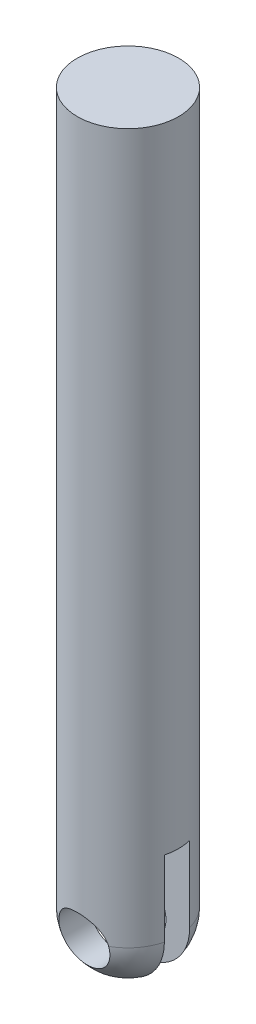
ISO-10303-21;
HEADER;
FILE_DESCRIPTION(('STEP AP214'),'2;1');
FILE_NAME('part.step','',(''),(''),'','','');
FILE_SCHEMA(('AUTOMOTIVE_DESIGN { 1 0 10303 214 1 1 1 1 }'));
ENDSEC;
DATA;
#1=APPLICATION_CONTEXT('core data for automotive mechanical design processes');
#2=APPLICATION_PROTOCOL_DEFINITION('international standard','automotive_design',2000,#1);
#3=PRODUCT_CONTEXT('',#1,'mechanical');
#4=PRODUCT('Part','Part','',(#3));
#5=PRODUCT_RELATED_PRODUCT_CATEGORY('part','',(#4));
#6=PRODUCT_DEFINITION_FORMATION('','',#4);
#7=PRODUCT_DEFINITION_CONTEXT('part definition',#1,'design');
#8=PRODUCT_DEFINITION('design','',#6,#7);
#9=PRODUCT_DEFINITION_SHAPE('','',#8);
#10=(LENGTH_UNIT() NAMED_UNIT(*) SI_UNIT(.MILLI.,.METRE.));
#11=(NAMED_UNIT(*) PLANE_ANGLE_UNIT() SI_UNIT($,.RADIAN.));
#12=(NAMED_UNIT(*) SI_UNIT($,.STERADIAN.) SOLID_ANGLE_UNIT());
#13=UNCERTAINTY_MEASURE_WITH_UNIT(LENGTH_MEASURE(1.E-05),#10,'distance_accuracy_value','');
#14=(GEOMETRIC_REPRESENTATION_CONTEXT(3) GLOBAL_UNCERTAINTY_ASSIGNED_CONTEXT((#13)) GLOBAL_UNIT_ASSIGNED_CONTEXT((#10,
#11,#12)) REPRESENTATION_CONTEXT('',''));
#15=CARTESIAN_POINT('',(0.,0.,0.));
#16=DIRECTION('',(0.,0.,1.));
#17=DIRECTION('',(1.,0.,0.));
#18=AXIS2_PLACEMENT_3D('',#15,#16,#17);
#19=CARTESIAN_POINT('',(0.,93.5,2.5));
#20=DIRECTION('',(0.,1.,0.));
#21=DIRECTION('',(1.,0.,0.));
#22=AXIS2_PLACEMENT_3D('',#19,#20,#21);
#23=SPHERICAL_SURFACE('',#22,10.);
#24=CARTESIAN_POINT('',(0.,93.5,2.5));
#25=DIRECTION('',(0.,1.,0.));
#26=DIRECTION('',(-1.,0.,0.));
#27=AXIS2_PLACEMENT_3D('',#24,#25,#26);
#28=CIRCLE('',#27,10.);
#29=CARTESIAN_POINT('',(4.89897948556635,93.5,11.2177978870813));
#30=VERTEX_POINT('',#29);
#31=CARTESIAN_POINT('',(9.68245836551854,93.5,5.));
#32=VERTEX_POINT('',#31);
#33=EDGE_CURVE('E111',#30,#32,#28,.T.);
#34=ORIENTED_EDGE('',*,*,#33,.F.);
#35=CARTESIAN_POINT('',(4.89893865648469,93.5002,11.2178208286245));
#36=CARTESIAN_POINT('',(4.92727418921963,93.3614873870076,11.2019098802133));
#37=CARTESIAN_POINT('',(4.94968515353325,93.2215887869732,11.1858184751447));
#38=CARTESIAN_POINT('',(4.98257086903547,92.9404311381345,11.1533879579725));
#39=CARTESIAN_POINT('',(4.99304624353029,92.799172160761,11.1370488588494));
#40=CARTESIAN_POINT('',(5.0019738665503,92.5163797265705,11.1042448150247));
#41=CARTESIAN_POINT('',(5.00043368842381,92.3748464988518,11.0877799561266));
#42=CARTESIAN_POINT('',(4.98536616484066,92.0924234657632,11.0548301095291));
#43=CARTESIAN_POINT('',(4.97183893845378,91.951533654016,11.0383451220313));
#44=CARTESIAN_POINT('',(4.93288594095179,91.6713588465171,11.0054681250731));
#45=CARTESIAN_POINT('',(4.90745701402313,91.5320742864509,10.9890761414407));
#46=CARTESIAN_POINT('',(4.84486426425658,91.256087182425,10.9565028063938));
#47=CARTESIAN_POINT('',(4.80769610914868,91.1193856114675,10.9403215350402));
#48=CARTESIAN_POINT('',(4.7219086944933,90.8496686132408,10.9083050231958));
#49=CARTESIAN_POINT('',(4.67329593200435,90.7166511422317,10.8924695919263));
#50=CARTESIAN_POINT('',(4.56492326752218,90.455123939594,10.8612494080196));
#51=CARTESIAN_POINT('',(4.50515926596108,90.3266158864868,10.8458648235431));
#52=CARTESIAN_POINT('',(4.37497965213287,90.0752178683008,10.8156877757602));
#53=CARTESIAN_POINT('',(4.3045755866293,89.9523219987986,10.8008946922911));
#54=CARTESIAN_POINT('',(4.1535285386618,89.7128420516729,10.7719945007179));
#55=CARTESIAN_POINT('',(4.07288177337091,89.5962603287924,10.757887648728));
#56=CARTESIAN_POINT('',(3.90195221061515,89.3703307733303,10.7304829323995));
#57=CARTESIAN_POINT('',(3.81167169322654,89.2609812389448,10.7171848778025));
#58=CARTESIAN_POINT('',(3.62205669025078,89.05024590475,10.6914990601853));
#59=CARTESIAN_POINT('',(3.52271888930685,88.9488630465753,10.6791116335154));
#60=CARTESIAN_POINT('',(3.3162831566464,88.7553812276067,10.6554216350037));
#61=CARTESIAN_POINT('',(3.2092303992527,88.6632347446997,10.6441135260503));
#62=CARTESIAN_POINT('',(2.98760357675197,88.4882463710375,10.6225986329848));
#63=CARTESIAN_POINT('',(2.8730267477674,88.405407930117,10.6123922572621));
#64=CARTESIAN_POINT('',(2.63725372669888,88.249724839181,10.5931787316651));
#65=CARTESIAN_POINT('',(2.5160606199192,88.17687558573,10.5841710294487));
#66=CARTESIAN_POINT('',(2.26782923052538,88.0416440206182,10.567425746954));
#67=CARTESIAN_POINT('',(2.14078881888704,87.979265560444,10.559688634061));
#68=CARTESIAN_POINT('',(1.88278611087447,87.8659080562942,10.5456115639289));
#69=CARTESIAN_POINT('',(1.75186082723434,87.8148462145952,10.5392614639566));
#70=CARTESIAN_POINT('',(1.48611564854605,87.7238902138853,10.5279394657527));
#71=CARTESIAN_POINT('',(1.35129434101507,87.6840001626356,10.5229680744658));
#72=CARTESIAN_POINT('',(0.942516399613429,87.5816316505213,10.5102021912795));
#73=CARTESIAN_POINT('',(0.6639590033556,87.5363290797153,10.5045403355134));
#74=CARTESIAN_POINT('',(0.10498784504106,87.4932786771967,10.4991602063714));
#75=CARTESIAN_POINT('',(-0.17540524566824,87.495251646546,10.4994070375818));
#76=CARTESIAN_POINT('',(-0.732041754387001,87.5460064676561,10.5057493957929));
#77=CARTESIAN_POINT('',(-1.00828524491241,87.5947875004583,10.5118448204661));
#78=CARTESIAN_POINT('',(-1.41305667331737,87.7017892741581,10.5251851478467));
#79=CARTESIAN_POINT('',(-1.54635769687637,87.7430841163154,10.5303301131128));
#80=CARTESIAN_POINT('',(-1.80898194746745,87.8366347892742,10.5419713905297));
#81=CARTESIAN_POINT('',(-1.93830660679206,87.8888866190365,10.5484672093975));
#82=CARTESIAN_POINT('',(-2.19211805644866,88.003995718812,10.5627564980459));
#83=CARTESIAN_POINT('',(-2.31660304688135,88.0668568889419,10.5705504450197));
#84=CARTESIAN_POINT('',(-2.55978589867423,88.2026888928239,10.587363502297));
#85=CARTESIAN_POINT('',(-2.67848582817454,88.2756560773338,10.5963821703358));
#86=CARTESIAN_POINT('',(-2.9097997684792,88.4315118110538,10.6156094270802));
#87=CARTESIAN_POINT('',(-3.02238652548756,88.5144402152202,10.6258227912078));
#88=CARTESIAN_POINT('',(-3.24012192540225,88.6893435291115,10.6473187303041));
#89=CARTESIAN_POINT('',(-3.34527322625725,88.7813151777597,10.6586009197916));
#90=CARTESIAN_POINT('',(-3.54749670634417,88.973705687764,10.6821482509802));
#91=CARTESIAN_POINT('',(-3.64456585328322,89.0741276913978,10.6944137582488));
#92=CARTESIAN_POINT('',(-3.82988426286666,89.2826354873295,10.7198194774713));
#93=CARTESIAN_POINT('',(-3.91813666956991,89.3907185240214,10.7329593748118));
#94=CARTESIAN_POINT('',(-4.08586673205085,89.6146229738032,10.7601108669664));
#95=CARTESIAN_POINT('',(-4.16527637864741,89.7304946575952,10.7741280742079));
#96=CARTESIAN_POINT('',(-4.31401014619419,89.9684016807158,10.8028313983562));
#97=CARTESIAN_POINT('',(-4.38333786544718,90.0904347999368,10.8175172741416));
#98=CARTESIAN_POINT('',(-4.51150563753912,90.3399088603274,10.8474572126065));
#99=CARTESIAN_POINT('',(-4.57033986925048,90.4673527548271,10.8627115850153));
#100=CARTESIAN_POINT('',(-4.67705487918588,90.7266401026458,10.8936594848664));
#101=CARTESIAN_POINT('',(-4.72493959993084,90.8584819527655,10.9093528519513));
#102=CARTESIAN_POINT('',(-4.80977031188505,91.1266701310123,10.9411844791957));
#103=CARTESIAN_POINT('',(-4.84663313374619,91.2630424848936,10.9573251648839));
#104=CARTESIAN_POINT('',(-4.90867764521969,91.5383416759631,10.9898143177904));
#105=CARTESIAN_POINT('',(-4.9338635602074,91.6772675701852,11.0061627076458));
#106=CARTESIAN_POINT('',(-4.97238944399948,91.9566609002362,11.0389455020962));
#107=CARTESIAN_POINT('',(-4.98573611283209,92.0971274185736,11.0553798527406));
#108=CARTESIAN_POINT('',(-5.00051338745893,92.3786389327653,11.0882214435698));
#109=CARTESIAN_POINT('',(-5.00194817252947,92.5196837083603,11.1046286912437));
#110=CARTESIAN_POINT('',(-4.99288785861755,92.8016459229522,11.1373351912218));
#111=CARTESIAN_POINT('',(-4.98237245056434,92.9425627366304,11.1536342121859));
#112=CARTESIAN_POINT('',(-4.94949463156491,93.2227767786761,11.1859551155558));
#113=CARTESIAN_POINT('',(-4.92715371833351,93.3620764787199,11.2019774465557));
#114=CARTESIAN_POINT('',(-4.89893865648469,93.5002,11.2178208286246));
#115=B_SPLINE_CURVE_WITH_KNOTS('',3,(#35,#36,#37,#38,#39,#40,#41,#42,#43,#44,#45,#46,#47,#48,
#49,#50,#51,#52,#53,#54,#55,#56,#57,#58,#59,#60,#61,#62,#63,#64,#65,#66,#67,#68,#69,#70,#71,#72,
#73,#74,#75,#76,#77,#78,#79,#80,#81,#82,#83,#84,#85,#86,#87,#88,#89,#90,#91,#92,#93,#94,#95,#96,
#97,#98,#99,#100,#101,#102,#103,#104,#105,#106,#107,#108,#109,#110,#111,#112,#113,#114),
.UNSPECIFIED.,.F.,.F.,(4,2,2,2,2,2,2,2,2,2,2,2,2,2,2,2,2,2,2,2,2,2,2,2,2,2,2,2,2,2,2,2,2,2,2,2,
2,2,2,4),(0.,0.427273695896813,0.854525077474799,1.28150718621249,1.70848505369805,
2.13557620134619,2.56282514815607,2.98983212981988,3.41699640392128,3.84370039795307,
4.27056244277984,4.69732368281735,5.12424176788651,5.54883647946182,5.97358804285703,
6.39814320033011,6.82285418194122,7.24434690288125,7.66599439982471,8.50836086019737,
9.34575372241116,10.1831319337798,10.6016659234076,11.0200473470292,11.4385829088634,
11.8569677312731,12.2770860649816,12.6970534519534,13.1171777004552,13.5371515933976,
13.9601599972521,14.3830170542763,14.8061079611405,15.2290462876217,15.6550998521153,
16.0809991254064,16.506657221096,16.932165968618,17.3583989410056,17.7838597076409),.UNSPECIFIED.);
#116=CARTESIAN_POINT('',(-4.89897948556635,93.5,11.2177978870814));
#117=VERTEX_POINT('',#116);
#118=EDGE_CURVE('E53',#30,#117,#115,.T.);
#119=ORIENTED_EDGE('',*,*,#118,.T.);
#120=CARTESIAN_POINT('',(-9.68245836551856,93.5,5.));
#121=VERTEX_POINT('',#120);
#122=EDGE_CURVE('E114',#121,#117,#28,.T.);
#123=ORIENTED_EDGE('',*,*,#122,.F.);
#124=CARTESIAN_POINT('',(0.,93.5,5.));
#125=DIRECTION('',(0.,0.,1.));
#126=DIRECTION('',(0.,-1.,0.));
#127=AXIS2_PLACEMENT_3D('',#124,#125,#126);
#128=CIRCLE('',#127,9.68245836551855);
#129=EDGE_CURVE('E126',#121,#32,#128,.T.);
#130=ORIENTED_EDGE('',*,*,#129,.T.);
#131=EDGE_LOOP('',(#34,#119,#123,#130));
#132=FACE_BOUND('',#131,.T.);
#133=ADVANCED_FACE('F39',(#132),#23,.T.);
#134=CARTESIAN_POINT('',(0.,233.5,2.5));
#135=DIRECTION('',(0.,-1.,0.));
#136=DIRECTION('',(1.,0.,0.));
#137=AXIS2_PLACEMENT_3D('',#134,#135,#136);
#138=PLANE('',#137);
#139=CARTESIAN_POINT('',(0.,233.5,2.5));
#140=DIRECTION('',(0.,1.,0.));
#141=DIRECTION('',(-1.,0.,0.));
#142=AXIS2_PLACEMENT_3D('',#139,#140,#141);
#143=CIRCLE('',#142,10.);
#144=CARTESIAN_POINT('',(-9.99999999999999,233.5,2.5));
#145=VERTEX_POINT('',#144);
#146=EDGE_CURVE('E118',#145,#145,#143,.T.);
#147=ORIENTED_EDGE('',*,*,#146,.T.);
#148=EDGE_LOOP('',(#147));
#149=FACE_BOUND('',#148,.T.);
#150=ADVANCED_FACE('F41',(#149),#138,.F.);
#151=CARTESIAN_POINT('',(0.,233.5,2.5));
#152=DIRECTION('',(0.,1.,0.));
#153=DIRECTION('',(-1.,0.,0.));
#154=AXIS2_PLACEMENT_3D('',#151,#152,#153);
#155=CYLINDRICAL_SURFACE('',#154,10.);
#156=ORIENTED_EDGE('',*,*,#146,.F.);
#157=EDGE_LOOP('',(#156));
#158=FACE_BOUND('',#157,.T.);
#159=ORIENTED_EDGE('',*,*,#122,.T.);
#160=CARTESIAN_POINT('',(-4.89897948556635,93.5,11.2177978870814));
#161=CARTESIAN_POINT('',(-4.87104349833318,93.6369384855685,11.233478375009));
#162=CARTESIAN_POINT('',(-4.83741488474298,93.7723099813617,11.2522179650321));
#163=CARTESIAN_POINT('',(-4.75930365987262,94.0389163103772,11.294946850961));
#164=CARTESIAN_POINT('',(-4.71483008370714,94.1701544848942,11.3189317751864));
#165=CARTESIAN_POINT('',(-4.61570987501826,94.4272090332767,11.3712074102433));
#166=CARTESIAN_POINT('',(-4.56110445618861,94.5530449155461,11.3994805953781));
#167=CARTESIAN_POINT('',(-4.44213756616435,94.7991537347802,11.4594564697463));
#168=CARTESIAN_POINT('',(-4.37777409514467,94.9194255248247,11.4911598615877));
#169=CARTESIAN_POINT('',(-4.17123049744626,95.2702483854698,11.5897764896488));
#170=CARTESIAN_POINT('',(-4.01521589862719,95.4917850876563,11.6604075821168));
#171=CARTESIAN_POINT('',(-3.66982029663845,95.90666932499,11.8041589851695));
#172=CARTESIAN_POINT('',(-3.48039309764252,96.0999771459841,11.8772826275132));
#173=CARTESIAN_POINT('',(-3.1668573317209,96.371952846699,11.9860152543039));
#174=CARTESIAN_POINT('',(-3.05319684918641,96.4622110724451,12.0232952243291));
#175=CARTESIAN_POINT('',(-2.81798349877699,96.6328022897707,12.0955238119123));
#176=CARTESIAN_POINT('',(-2.69643360210925,96.7131389851578,12.1304732972087));
#177=CARTESIAN_POINT('',(-2.44611729460878,96.8632338074191,12.1970762184314));
#178=CARTESIAN_POINT('',(-2.31735114221229,96.9329923127995,12.2287297722794));
#179=CARTESIAN_POINT('',(-2.05346425440719,97.0612265404892,12.2878266038412));
#180=CARTESIAN_POINT('',(-1.91834692859288,97.1197082325667,12.3152721076456));
#181=CARTESIAN_POINT('',(-1.64834218796651,97.2226022756219,12.3641273235605));
#182=CARTESIAN_POINT('',(-1.51367453360394,97.2674949118097,12.3857390813795));
#183=CARTESIAN_POINT('',(-1.24038064451454,97.3457865302565,12.4237328975984));
#184=CARTESIAN_POINT('',(-1.10175638416906,97.3791911401861,12.4401175163456));
#185=CARTESIAN_POINT('',(-0.821669991821929,97.4340871595084,12.4671784080935));
#186=CARTESIAN_POINT('',(-0.680208939144742,97.4555830139871,12.477856810955));
#187=CARTESIAN_POINT('',(-0.395645237857533,97.4863754344659,12.4931856703762));
#188=CARTESIAN_POINT('',(-0.252542739820538,97.4956731105428,12.4978366754498));
#189=CARTESIAN_POINT('',(0.0198623327122231,97.501629428405,12.5008147075909));
#190=CARTESIAN_POINT('',(0.149134996902007,97.4994433970262,12.4997198166663));
#191=CARTESIAN_POINT('',(0.407029112407416,97.485078698897,12.4925457248736));
#192=CARTESIAN_POINT('',(0.53565034038626,97.4728968114429,12.4864649175242));
#193=CARTESIAN_POINT('',(0.791193089472857,97.4386866400429,12.4694737103009));
#194=CARTESIAN_POINT('',(0.918115312043412,97.4166625573939,12.4585653711544));
#195=CARTESIAN_POINT('',(1.16947473087862,97.3630085933616,12.4321854396539));
#196=CARTESIAN_POINT('',(1.29391095727814,97.3313750381117,12.4167121020878));
#197=CARTESIAN_POINT('',(1.53753539714847,97.2593973812568,12.3818463148536));
#198=CARTESIAN_POINT('',(1.65677509365263,97.2191961350442,12.3625184387188));
#199=CARTESIAN_POINT('',(1.89134748177165,97.1301795768773,12.3202360994228));
#200=CARTESIAN_POINT('',(2.0066787936292,97.0813612598762,12.2972803714074));
#201=CARTESIAN_POINT('',(2.34581151922415,96.9225992827286,12.223709476578));
#202=CARTESIAN_POINT('',(2.56294019078022,96.8002923162603,12.1683624610283));
#203=CARTESIAN_POINT('',(2.99198662061079,96.5149474307137,12.0447349812844));
#204=CARTESIAN_POINT('',(3.20201952118904,96.3493931870709,11.9757663556231));
#205=CARTESIAN_POINT('',(3.59278517505727,95.9875427810784,11.8346198515953));
#206=CARTESIAN_POINT('',(3.77348259834384,95.7912101018571,11.7624382349858));
#207=CARTESIAN_POINT('',(4.11617962811637,95.3531962199911,11.6156320605665));
#208=CARTESIAN_POINT('',(4.27523725244417,95.1090676955732,11.5413307706622));
#209=CARTESIAN_POINT('',(4.48085164409501,94.7233339511661,11.4402354482765));
#210=CARTESIAN_POINT('',(4.54386186974605,94.591598139032,11.4082818422301));
#211=CARTESIAN_POINT('',(4.65840023005525,94.3222710852403,11.3489243641956));
#212=CARTESIAN_POINT('',(4.70993625679031,94.1846839462483,11.3215173683282));
#213=CARTESIAN_POINT('',(4.78433735318512,93.9556397368281,11.281298303135));
#214=CARTESIAN_POINT('',(4.81080902394751,93.8656290629946,11.2668057909693));
#215=CARTESIAN_POINT('',(4.85870427077353,93.6839812295806,11.2403502507724));
#216=CARTESIAN_POINT('',(4.88013147156932,93.5923452890728,11.2283854071093));
#217=CARTESIAN_POINT('',(4.89897948556635,93.5,11.2177978870813));
#218=B_SPLINE_CURVE_WITH_KNOTS('',3,(#160,#161,#162,#163,#164,#165,#166,#167,#168,#169,#170,
#171,#172,#173,#174,#175,#176,#177,#178,#179,#180,#181,#182,#183,#184,#185,#186,#187,#188,#189,
#190,#191,#192,#193,#194,#195,#196,#197,#198,#199,#200,#201,#202,#203,#204,#205,#206,#207,#208,
#209,#210,#211,#212,#213,#214,#215,#216,#217),.UNSPECIFIED.,.F.,.F.,(4,2,2,2,2,2,2,2,2,2,2,2,2,
2,2,2,2,2,2,2,2,2,2,2,2,2,2,2,4),(0.,0.421672305953377,0.842994502922417,1.26263901908108,
1.68236965415838,2.51865705181693,3.35610988446723,3.80518928425794,4.25410052813424,
4.70299570538355,5.151652588191,5.58182977746259,6.01179593349062,6.44160149116709,
6.87136793232118,7.258778902637,7.64631474731075,8.03368532395691,8.42120418582105,
8.8027068308287,9.18434278175017,9.94702519497318,10.7722025163055,11.5983663784935,
12.4955393601446,12.9434998164928,13.3911512024052,13.6757912642916,13.9602261679081),.UNSPECIFIED.);
#219=EDGE_CURVE('E101',#117,#30,#218,.T.);
#220=ORIENTED_EDGE('',*,*,#219,.T.);
#221=ORIENTED_EDGE('',*,*,#33,.T.);
#222=DIRECTION('',(0.,1.,0.));
#223=VECTOR('',#222,1.);
#224=CARTESIAN_POINT('',(9.68245836551855,233.5,5.00000000000002));
#225=LINE('',#224,#223);
#226=CARTESIAN_POINT('',(9.68245836551854,108.400596071662,5.));
#227=VERTEX_POINT('',#226);
#228=EDGE_CURVE('E112',#32,#227,#225,.T.);
#229=ORIENTED_EDGE('',*,*,#228,.T.);
#230=CARTESIAN_POINT('',(0.,108.400596071662,2.5));
#231=DIRECTION('',(0.,1.,0.));
#232=DIRECTION('',(0.,0.,1.));
#233=AXIS2_PLACEMENT_3D('',#230,#231,#232);
#234=CIRCLE('',#233,10.);
#235=CARTESIAN_POINT('',(9.68245836551853,108.400596071662,0.));
#236=VERTEX_POINT('',#235);
#237=EDGE_CURVE('E48',#227,#236,#234,.T.);
#238=ORIENTED_EDGE('',*,*,#237,.T.);
#239=DIRECTION('',(0.,1.,0.));
#240=VECTOR('',#239,1.);
#241=CARTESIAN_POINT('',(9.68245836551855,233.5,0.));
#242=LINE('',#241,#240);
#243=CARTESIAN_POINT('',(9.68245836551854,93.5,0.));
#244=VERTEX_POINT('',#243);
#245=EDGE_CURVE('E199',#236,#244,#242,.F.);
#246=ORIENTED_EDGE('',*,*,#245,.T.);
#247=CARTESIAN_POINT('',(4.89897948556635,93.5,-6.21779788708135));
#248=VERTEX_POINT('',#247);
#249=EDGE_CURVE('E99',#244,#248,#28,.T.);
#250=ORIENTED_EDGE('',*,*,#249,.T.);
#251=CARTESIAN_POINT('',(4.89897948556635,93.5,-6.21779788708134));
#252=CARTESIAN_POINT('',(4.87104349833318,93.6369384855685,-6.233478375009));
#253=CARTESIAN_POINT('',(4.83741488474298,93.7723099813617,-6.25221796503205));
#254=CARTESIAN_POINT('',(4.75930365987262,94.0389163103772,-6.29494685096101));
#255=CARTESIAN_POINT('',(4.71483008370714,94.1701544848942,-6.31893177518635));
#256=CARTESIAN_POINT('',(4.61570987501826,94.4272090332767,-6.37120741024334));
#257=CARTESIAN_POINT('',(4.56110445618861,94.5530449155461,-6.39948059537804));
#258=CARTESIAN_POINT('',(4.44213756616435,94.7991537347802,-6.45945646974632));
#259=CARTESIAN_POINT('',(4.37777409514467,94.9194255248247,-6.49115986158769));
#260=CARTESIAN_POINT('',(4.17123049744626,95.2702483854698,-6.58977648964884));
#261=CARTESIAN_POINT('',(4.01521589862719,95.4917850876563,-6.66040758211675));
#262=CARTESIAN_POINT('',(3.66982029663845,95.90666932499,-6.80415898516953));
#263=CARTESIAN_POINT('',(3.48039309764252,96.0999771459841,-6.87728262751317));
#264=CARTESIAN_POINT('',(3.1668573317209,96.371952846699,-6.9860152543039));
#265=CARTESIAN_POINT('',(3.05319684918641,96.4622110724451,-7.02329522432906));
#266=CARTESIAN_POINT('',(2.817983498777,96.6328022897707,-7.09552381191233));
#267=CARTESIAN_POINT('',(2.69643360210925,96.7131389851578,-7.13047329720867));
#268=CARTESIAN_POINT('',(2.44611729460878,96.8632338074191,-7.19707621843141));
#269=CARTESIAN_POINT('',(2.31735114221229,96.9329923127995,-7.22872977227934));
#270=CARTESIAN_POINT('',(2.05346425440718,97.0612265404892,-7.28782660384117));
#271=CARTESIAN_POINT('',(1.91834692859288,97.1197082325667,-7.31527210764558));
#272=CARTESIAN_POINT('',(1.64834218796651,97.2226022756219,-7.3641273235605));
#273=CARTESIAN_POINT('',(1.51367453360394,97.2674949118096,-7.38573908137951));
#274=CARTESIAN_POINT('',(1.24038064451455,97.3457865302565,-7.42373289759839));
#275=CARTESIAN_POINT('',(1.10175638416906,97.3791911401861,-7.4401175163456));
#276=CARTESIAN_POINT('',(0.821669991821929,97.4340871595084,-7.4671784080935));
#277=CARTESIAN_POINT('',(0.680208939144741,97.4555830139871,-7.477856810955));
#278=CARTESIAN_POINT('',(0.395645237857532,97.4863754344659,-7.49318567037625));
#279=CARTESIAN_POINT('',(0.252542739820537,97.4956731105428,-7.4978366754498));
#280=CARTESIAN_POINT('',(-0.0198623327122239,97.501629428405,-7.50081470759086));
#281=CARTESIAN_POINT('',(-0.149134996902008,97.4994433970262,-7.4997198166663));
#282=CARTESIAN_POINT('',(-0.407029112407417,97.485078698897,-7.49254572487357));
#283=CARTESIAN_POINT('',(-0.535650340386261,97.4728968114429,-7.48646491752423));
#284=CARTESIAN_POINT('',(-0.791193089472856,97.4386866400429,-7.46947371030086));
#285=CARTESIAN_POINT('',(-0.91811531204341,97.4166625573939,-7.45856537115443));
#286=CARTESIAN_POINT('',(-1.16947473087862,97.3630085933616,-7.43218543965391));
#287=CARTESIAN_POINT('',(-1.29391095727814,97.3313750381117,-7.41671210208776));
#288=CARTESIAN_POINT('',(-1.53753539714847,97.2593973812568,-7.38184631485359));
#289=CARTESIAN_POINT('',(-1.65677509365263,97.2191961350442,-7.36251843871884));
#290=CARTESIAN_POINT('',(-1.89134748177165,97.1301795768773,-7.32023609942282));
#291=CARTESIAN_POINT('',(-2.0066787936292,97.0813612598762,-7.29728037140741));
#292=CARTESIAN_POINT('',(-2.34581151922415,96.9225992827286,-7.22370947657796));
#293=CARTESIAN_POINT('',(-2.56294019078023,96.8002923162603,-7.16836246102831));
#294=CARTESIAN_POINT('',(-2.99198662061079,96.5149474307137,-7.04473498128436));
#295=CARTESIAN_POINT('',(-3.20201952118904,96.3493931870709,-6.9757663556231));
#296=CARTESIAN_POINT('',(-3.59278517505727,95.9875427810784,-6.83461985159527));
#297=CARTESIAN_POINT('',(-3.77348259834384,95.7912101018571,-6.76243823498584));
#298=CARTESIAN_POINT('',(-4.11617962811637,95.3531962199911,-6.61563206056646));
#299=CARTESIAN_POINT('',(-4.27523725244417,95.1090676955732,-6.54133077066218));
#300=CARTESIAN_POINT('',(-4.48085164409501,94.7233339511661,-6.44023544827651));
#301=CARTESIAN_POINT('',(-4.54386186974605,94.591598139032,-6.40828184223013));
#302=CARTESIAN_POINT('',(-4.65840023005525,94.3222710852403,-6.34892436419565));
#303=CARTESIAN_POINT('',(-4.70993625679031,94.1846839462483,-6.32151736832826));
#304=CARTESIAN_POINT('',(-4.78433735318512,93.9556397368281,-6.28129830313504));
#305=CARTESIAN_POINT('',(-4.81080902394751,93.8656290629946,-6.26680579096934));
#306=CARTESIAN_POINT('',(-4.85870427077353,93.6839812295806,-6.24035025077242));
#307=CARTESIAN_POINT('',(-4.88013147156932,93.5923452890728,-6.22838540710932));
#308=CARTESIAN_POINT('',(-4.89897948556635,93.5,-6.21779788708136));
#309=B_SPLINE_CURVE_WITH_KNOTS('',3,(#251,#252,#253,#254,#255,#256,#257,#258,#259,#260,#261,
#262,#263,#264,#265,#266,#267,#268,#269,#270,#271,#272,#273,#274,#275,#276,#277,#278,#279,#280,
#281,#282,#283,#284,#285,#286,#287,#288,#289,#290,#291,#292,#293,#294,#295,#296,#297,#298,#299,
#300,#301,#302,#303,#304,#305,#306,#307,#308),.UNSPECIFIED.,.F.,.F.,(4,2,2,2,2,2,2,2,2,2,2,2,2,
2,2,2,2,2,2,2,2,2,2,2,2,2,2,2,4),(0.,0.421672305953377,0.842994502922418,1.26263901908107,
1.68236965415838,2.51865705181694,3.35610988446723,3.80518928425794,4.25410052813424,
4.70299570538356,5.151652588191,5.58182977746258,6.01179593349062,6.44160149116709,
6.87136793232118,7.258778902637,7.64631474731075,8.0336853239569,8.42120418582105,
8.8027068308287,9.18434278175017,9.94702519497318,10.7722025163055,11.5983663784935,
12.4955393601446,12.9434998164928,13.3911512024052,13.6757912642916,13.9602261679081),.UNSPECIFIED.);
#310=CARTESIAN_POINT('',(-4.89897948556635,93.5,-6.21779788708136));
#311=VERTEX_POINT('',#310);
#312=EDGE_CURVE('E64',#248,#311,#309,.T.);
#313=ORIENTED_EDGE('',*,*,#312,.T.);
#314=CARTESIAN_POINT('',(-9.68245836551856,93.5,0.));
#315=VERTEX_POINT('',#314);
#316=EDGE_CURVE('E96',#311,#315,#28,.T.);
#317=ORIENTED_EDGE('',*,*,#316,.T.);
#318=DIRECTION('',(0.,1.,0.));
#319=VECTOR('',#318,1.);
#320=CARTESIAN_POINT('',(-9.68245836551854,233.5,0.));
#321=LINE('',#320,#319);
#322=CARTESIAN_POINT('',(-9.68245836551855,108.400596071662,0.));
#323=VERTEX_POINT('',#322);
#324=EDGE_CURVE('E205',#315,#323,#321,.T.);
#325=ORIENTED_EDGE('',*,*,#324,.T.);
#326=CARTESIAN_POINT('',(-9.68245836551855,108.400596071662,5.));
#327=VERTEX_POINT('',#326);
#328=EDGE_CURVE('E11',#323,#327,#234,.T.);
#329=ORIENTED_EDGE('',*,*,#328,.T.);
#330=DIRECTION('',(0.,1.,0.));
#331=VECTOR('',#330,1.);
#332=CARTESIAN_POINT('',(-9.68245836551853,233.5,5.00000000000002));
#333=LINE('',#332,#331);
#334=EDGE_CURVE('E119',#327,#121,#333,.F.);
#335=ORIENTED_EDGE('',*,*,#334,.T.);
#336=EDGE_LOOP('',(#159,#220,#221,#229,#238,#246,#250,#313,#317,#325,#329,#335));
#337=FACE_BOUND('',#336,.T.);
#338=ADVANCED_FACE('F91',(#158,#337),#155,.T.);
#339=ORIENTED_EDGE('',*,*,#316,.F.);
#340=CARTESIAN_POINT('',(-4.89893865648469,93.5002,-6.21782082862456));
#341=CARTESIAN_POINT('',(-4.92727418921963,93.3614873870076,-6.20190988021332));
#342=CARTESIAN_POINT('',(-4.94968515353325,93.2215887869732,-6.18581847514466));
#343=CARTESIAN_POINT('',(-4.98257086903547,92.9404311381345,-6.15338795797251));
#344=CARTESIAN_POINT('',(-4.99304624353029,92.799172160761,-6.13704885884937));
#345=CARTESIAN_POINT('',(-5.0019738665503,92.5163797265705,-6.10424481502466));
#346=CARTESIAN_POINT('',(-5.00043368842381,92.3748464988518,-6.08777995612661));
#347=CARTESIAN_POINT('',(-4.98536616484066,92.0924234657632,-6.05483010952916));
#348=CARTESIAN_POINT('',(-4.97183893845378,91.951533654016,-6.03834512203133));
#349=CARTESIAN_POINT('',(-4.93288594095179,91.6713588465171,-6.00546812507309));
#350=CARTESIAN_POINT('',(-4.90745701402313,91.5320742864509,-5.98907614144073));
#351=CARTESIAN_POINT('',(-4.84486426425658,91.256087182425,-5.95650280639385));
#352=CARTESIAN_POINT('',(-4.80769610914868,91.1193856114675,-5.94032153504018));
#353=CARTESIAN_POINT('',(-4.7219086944933,90.8496686132408,-5.90830502319584));
#354=CARTESIAN_POINT('',(-4.67329593200435,90.7166511422317,-5.89246959192635));
#355=CARTESIAN_POINT('',(-4.56492326752218,90.455123939594,-5.86124940801957));
#356=CARTESIAN_POINT('',(-4.50515926596108,90.3266158864868,-5.8458648235431));
#357=CARTESIAN_POINT('',(-4.37497965213287,90.0752178683008,-5.81568777576026));
#358=CARTESIAN_POINT('',(-4.30457558662928,89.9523219987986,-5.80089469229109));
#359=CARTESIAN_POINT('',(-4.15352853866178,89.7128420516729,-5.77199450071786));
#360=CARTESIAN_POINT('',(-4.0728817733709,89.5962603287923,-5.75788764872803));
#361=CARTESIAN_POINT('',(-3.90195221061514,89.3703307733303,-5.73048293239947));
#362=CARTESIAN_POINT('',(-3.81167169322653,89.2609812389448,-5.71718487780253));
#363=CARTESIAN_POINT('',(-3.62205669025077,89.05024590475,-5.69149906018535));
#364=CARTESIAN_POINT('',(-3.52271888930684,88.9488630465753,-5.67911163351542));
#365=CARTESIAN_POINT('',(-3.31628315664639,88.7553812276067,-5.65542163500371));
#366=CARTESIAN_POINT('',(-3.20923039925269,88.6632347446997,-5.64411352605036));
#367=CARTESIAN_POINT('',(-2.98760357675197,88.4882463710375,-5.6225986329848));
#368=CARTESIAN_POINT('',(-2.87302674776739,88.405407930117,-5.61239225726212));
#369=CARTESIAN_POINT('',(-2.63725372669888,88.249724839181,-5.59317873166508));
#370=CARTESIAN_POINT('',(-2.5160606199192,88.17687558573,-5.58417102944869));
#371=CARTESIAN_POINT('',(-2.26782923052538,88.0416440206182,-5.56742574695401));
#372=CARTESIAN_POINT('',(-2.14078881888704,87.979265560444,-5.55968863406098));
#373=CARTESIAN_POINT('',(-1.88278611087447,87.8659080562942,-5.54561156392891));
#374=CARTESIAN_POINT('',(-1.75186082723434,87.8148462145952,-5.53926146395657));
#375=CARTESIAN_POINT('',(-1.48611564854605,87.7238902138853,-5.52793946575273));
#376=CARTESIAN_POINT('',(-1.35129434101507,87.6840001626356,-5.52296807446585));
#377=CARTESIAN_POINT('',(-0.942516399613429,87.5816316505213,-5.51020219127945));
#378=CARTESIAN_POINT('',(-0.6639590033556,87.5363290797153,-5.50454033551344));
#379=CARTESIAN_POINT('',(-0.104987845041059,87.4932786771967,-5.49916020637143));
#380=CARTESIAN_POINT('',(0.17540524566824,87.495251646546,-5.49940703758177));
#381=CARTESIAN_POINT('',(0.732041754387,87.5460064676561,-5.50574939579288));
#382=CARTESIAN_POINT('',(1.00828524491241,87.5947875004583,-5.51184482046606));
#383=CARTESIAN_POINT('',(1.41305667331737,87.7017892741581,-5.52518514784674));
#384=CARTESIAN_POINT('',(1.54635769687637,87.7430841163154,-5.53033011311284));
#385=CARTESIAN_POINT('',(1.80898194746745,87.8366347892742,-5.54197139052974));
#386=CARTESIAN_POINT('',(1.93830660679206,87.8888866190365,-5.54846720939748));
#387=CARTESIAN_POINT('',(2.19211805644866,88.003995718812,-5.56275649804591));
#388=CARTESIAN_POINT('',(2.31660304688135,88.0668568889419,-5.57055044501966));
#389=CARTESIAN_POINT('',(2.55978589867423,88.2026888928239,-5.58736350229702));
#390=CARTESIAN_POINT('',(2.67848582817454,88.2756560773338,-5.59638217033582));
#391=CARTESIAN_POINT('',(2.9097997684792,88.4315118110538,-5.61560942708021));
#392=CARTESIAN_POINT('',(3.02238652548756,88.5144402152202,-5.62582279120775));
#393=CARTESIAN_POINT('',(3.24012192540225,88.6893435291115,-5.64731873030414));
#394=CARTESIAN_POINT('',(3.34527322625725,88.7813151777597,-5.65860091979158));
#395=CARTESIAN_POINT('',(3.54749670634417,88.973705687764,-5.68214825098024));
#396=CARTESIAN_POINT('',(3.64456585328322,89.0741276913978,-5.69441375824883));
#397=CARTESIAN_POINT('',(3.82988426286666,89.2826354873295,-5.71981947747132));
#398=CARTESIAN_POINT('',(3.91813666956991,89.3907185240214,-5.73295937481182));
#399=CARTESIAN_POINT('',(4.08586673205085,89.6146229738032,-5.76011086696643));
#400=CARTESIAN_POINT('',(4.16527637864741,89.7304946575952,-5.77412807420788));
#401=CARTESIAN_POINT('',(4.31401014619419,89.9684016807158,-5.80283139835615));
#402=CARTESIAN_POINT('',(4.38333786544718,90.0904347999368,-5.81751727414155));
#403=CARTESIAN_POINT('',(4.51150563753912,90.3399088603274,-5.8474572126065));
#404=CARTESIAN_POINT('',(4.57033986925048,90.4673527548271,-5.86271158501524));
#405=CARTESIAN_POINT('',(4.67705487918588,90.7266401026458,-5.89365948486643));
#406=CARTESIAN_POINT('',(4.72493959993084,90.8584819527655,-5.90935285195132));
#407=CARTESIAN_POINT('',(4.80977031188504,91.1266701310123,-5.94118447919564));
#408=CARTESIAN_POINT('',(4.84663313374619,91.2630424848936,-5.95732516488393));
#409=CARTESIAN_POINT('',(4.90867764521969,91.5383416759631,-5.98981431779043));
#410=CARTESIAN_POINT('',(4.93386356020739,91.6772675701852,-6.00616270764579));
#411=CARTESIAN_POINT('',(4.97238944399948,91.9566609002362,-6.03894550209624));
#412=CARTESIAN_POINT('',(4.98573611283209,92.0971274185736,-6.05537985274058));
#413=CARTESIAN_POINT('',(5.00051338745893,92.3786389327653,-6.08822144356982));
#414=CARTESIAN_POINT('',(5.00194817252947,92.5196837083603,-6.10462869124365));
#415=CARTESIAN_POINT('',(4.99288785861755,92.8016459229522,-6.13733519122176));
#416=CARTESIAN_POINT('',(4.98237245056434,92.9425627366304,-6.15363421218588));
#417=CARTESIAN_POINT('',(4.94949463156491,93.2227767786761,-6.18595511555578));
#418=CARTESIAN_POINT('',(4.92715371833351,93.3620764787199,-6.20197744655565));
#419=CARTESIAN_POINT('',(4.89893865648469,93.5002,-6.21782082862455));
#420=B_SPLINE_CURVE_WITH_KNOTS('',3,(#340,#341,#342,#343,#344,#345,#346,#347,#348,#349,#350,
#351,#352,#353,#354,#355,#356,#357,#358,#359,#360,#361,#362,#363,#364,#365,#366,#367,#368,#369,
#370,#371,#372,#373,#374,#375,#376,#377,#378,#379,#380,#381,#382,#383,#384,#385,#386,#387,#388,
#389,#390,#391,#392,#393,#394,#395,#396,#397,#398,#399,#400,#401,#402,#403,#404,#405,#406,#407,
#408,#409,#410,#411,#412,#413,#414,#415,#416,#417,#418,#419),.UNSPECIFIED.,.F.,.F.,(4,2,2,2,2,2,
2,2,2,2,2,2,2,2,2,2,2,2,2,2,2,2,2,2,2,2,2,2,2,2,2,2,2,2,2,2,2,2,2,4),(0.,0.427273695896812,
0.854525077474799,1.28150718621249,1.70848505369805,2.13557620134619,2.56282514815606,
2.98983212981988,3.41699640392129,3.8437003979531,4.27056244277985,4.69732368281736,
5.12424176788651,5.54883647946183,5.97358804285703,6.39814320033011,6.82285418194122,
7.24434690288125,7.66599439982471,8.50836086019737,9.34575372241116,10.1831319337798,
10.6016659234076,11.0200473470292,11.4385829088634,11.8569677312731,12.2770860649816,
12.6970534519533,13.1171777004552,13.5371515933976,13.9601599972521,14.3830170542763,
14.8061079611405,15.2290462876217,15.6550998521153,16.0809991254064,16.506657221096,
16.932165968618,17.3583989410056,17.7838597076409),.UNSPECIFIED.);
#421=EDGE_CURVE('E105',#311,#248,#420,.T.);
#422=ORIENTED_EDGE('',*,*,#421,.T.);
#423=ORIENTED_EDGE('',*,*,#249,.F.);
#424=CARTESIAN_POINT('',(0.,93.5,0.));
#425=DIRECTION('',(0.,0.,-1.));
#426=DIRECTION('',(-1.,0.,0.));
#427=AXIS2_PLACEMENT_3D('',#424,#425,#426);
#428=CIRCLE('',#427,9.68245836551855);
#429=EDGE_CURVE('E109',#244,#315,#428,.T.);
#430=ORIENTED_EDGE('',*,*,#429,.T.);
#431=EDGE_LOOP('',(#339,#422,#423,#430));
#432=FACE_BOUND('',#431,.T.);
#433=ADVANCED_FACE('F108',(#432),#23,.T.);
#434=CARTESIAN_POINT('',(-10.,108.400596071662,5.));
#435=DIRECTION('',(0.,1.,0.));
#436=DIRECTION('',(0.,0.,1.));
#437=AXIS2_PLACEMENT_3D('',#434,#435,#436);
#438=PLANE('',#437);
#439=DIRECTION('',(1.,0.,0.));
#440=VECTOR('',#439,1.);
#441=CARTESIAN_POINT('',(-10.,108.400596071662,5.));
#442=LINE('',#441,#440);
#443=EDGE_CURVE('E134',#327,#227,#442,.T.);
#444=ORIENTED_EDGE('',*,*,#443,.F.);
#445=ORIENTED_EDGE('',*,*,#328,.F.);
#446=DIRECTION('',(1.,0.,0.));
#447=VECTOR('',#446,1.);
#448=CARTESIAN_POINT('',(-10.,108.400596071662,0.));
#449=LINE('',#448,#447);
#450=EDGE_CURVE('E169',#323,#236,#449,.T.);
#451=ORIENTED_EDGE('',*,*,#450,.T.);
#452=ORIENTED_EDGE('',*,*,#237,.F.);
#453=EDGE_LOOP('',(#444,#445,#451,#452));
#454=FACE_BOUND('',#453,.T.);
#455=ADVANCED_FACE('F145',(#454),#438,.F.);
#456=CARTESIAN_POINT('',(-10.,108.400596071662,5.));
#457=DIRECTION('',(0.,0.,1.));
#458=DIRECTION('',(0.,-1.,0.));
#459=AXIS2_PLACEMENT_3D('',#456,#457,#458);
#460=PLANE('',#459);
#461=CARTESIAN_POINT('',(0.,92.5,5.));
#462=DIRECTION('',(0.,0.,1.));
#463=DIRECTION('',(0.,-1.,0.));
#464=AXIS2_PLACEMENT_3D('',#461,#462,#463);
#465=CIRCLE('',#464,5.);
#466=CARTESIAN_POINT('',(0.,87.5,5.));
#467=VERTEX_POINT('',#466);
#468=EDGE_CURVE('E106',#467,#467,#465,.T.);
#469=ORIENTED_EDGE('',*,*,#468,.T.);
#470=EDGE_LOOP('',(#469));
#471=FACE_BOUND('',#470,.T.);
#472=ORIENTED_EDGE('',*,*,#129,.F.);
#473=ORIENTED_EDGE('',*,*,#334,.F.);
#474=ORIENTED_EDGE('',*,*,#443,.T.);
#475=ORIENTED_EDGE('',*,*,#228,.F.);
#476=EDGE_LOOP('',(#472,#473,#474,#475));
#477=FACE_BOUND('',#476,.T.);
#478=ADVANCED_FACE('F130',(#471,#477),#460,.F.);
#479=CARTESIAN_POINT('',(-10.,108.400596071662,0.));
#480=DIRECTION('',(0.,0.,-1.));
#481=DIRECTION('',(-1.,0.,0.));
#482=AXIS2_PLACEMENT_3D('',#479,#480,#481);
#483=PLANE('',#482);
#484=CARTESIAN_POINT('',(0.,92.5,0.));
#485=DIRECTION('',(0.,0.,-1.));
#486=DIRECTION('',(-1.,0.,0.));
#487=AXIS2_PLACEMENT_3D('',#484,#485,#486);
#488=CIRCLE('',#487,5.);
#489=CARTESIAN_POINT('',(-5.,92.5,0.));
#490=VERTEX_POINT('',#489);
#491=EDGE_CURVE('E43',#490,#490,#488,.T.);
#492=ORIENTED_EDGE('',*,*,#491,.T.);
#493=EDGE_LOOP('',(#492));
#494=FACE_BOUND('',#493,.T.);
#495=ORIENTED_EDGE('',*,*,#429,.F.);
#496=ORIENTED_EDGE('',*,*,#245,.F.);
#497=ORIENTED_EDGE('',*,*,#450,.F.);
#498=ORIENTED_EDGE('',*,*,#324,.F.);
#499=EDGE_LOOP('',(#495,#496,#497,#498));
#500=FACE_BOUND('',#499,.T.);
#501=ADVANCED_FACE('F186',(#494,#500),#483,.F.);
#502=CARTESIAN_POINT('',(0.,92.5,-7.5));
#503=DIRECTION('',(0.,0.,1.));
#504=DIRECTION('',(1.,0.,0.));
#505=AXIS2_PLACEMENT_3D('',#502,#503,#504);
#506=CYLINDRICAL_SURFACE('',#505,5.);
#507=ORIENTED_EDGE('',*,*,#491,.F.);
#508=EDGE_LOOP('',(#507));
#509=FACE_BOUND('',#508,.T.);
#510=ORIENTED_EDGE('',*,*,#421,.F.);
#511=ORIENTED_EDGE('',*,*,#312,.F.);
#512=EDGE_LOOP('',(#510,#511));
#513=FACE_BOUND('',#512,.T.);
#514=ADVANCED_FACE('F102',(#509,#513),#506,.F.);
#515=ORIENTED_EDGE('',*,*,#468,.F.);
#516=EDGE_LOOP('',(#515));
#517=FACE_BOUND('',#516,.T.);
#518=ORIENTED_EDGE('',*,*,#219,.F.);
#519=ORIENTED_EDGE('',*,*,#118,.F.);
#520=EDGE_LOOP('',(#518,#519));
#521=FACE_BOUND('',#520,.T.);
#522=ADVANCED_FACE('F173',(#517,#521),#506,.F.);
#523=CLOSED_SHELL('',(#133,#150,#338,#433,#455,#478,#501,#514,#522));
#524=MANIFOLD_SOLID_BREP('B2',#523);
#525=ADVANCED_BREP_SHAPE_REPRESENTATION('',(#18,#524),#14);
#526=SHAPE_DEFINITION_REPRESENTATION(#9,#525);
ENDSEC;
END-ISO-10303-21;
